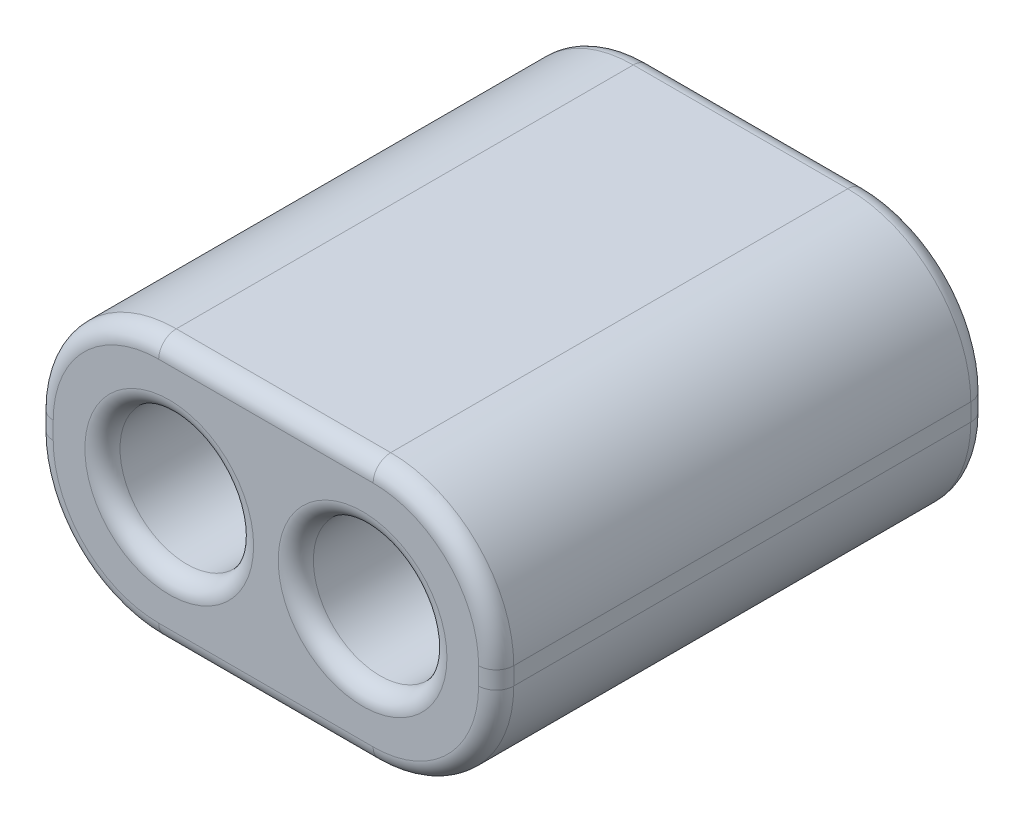
ISO-10303-21;
HEADER;
FILE_DESCRIPTION(('STEP AP214'),'2;1');
FILE_NAME('part.step','',(''),(''),'','','');
FILE_SCHEMA(('AUTOMOTIVE_DESIGN { 1 0 10303 214 1 1 1 1 }'));
ENDSEC;
DATA;
#1=APPLICATION_CONTEXT('core data for automotive mechanical design processes');
#2=APPLICATION_PROTOCOL_DEFINITION('international standard','automotive_design',2000,#1);
#3=PRODUCT_CONTEXT('',#1,'mechanical');
#4=PRODUCT('Part','Part','',(#3));
#5=PRODUCT_RELATED_PRODUCT_CATEGORY('part','',(#4));
#6=PRODUCT_DEFINITION_FORMATION('','',#4);
#7=PRODUCT_DEFINITION_CONTEXT('part definition',#1,'design');
#8=PRODUCT_DEFINITION('design','',#6,#7);
#9=PRODUCT_DEFINITION_SHAPE('','',#8);
#10=(LENGTH_UNIT() NAMED_UNIT(*) SI_UNIT(.MILLI.,.METRE.));
#11=(NAMED_UNIT(*) PLANE_ANGLE_UNIT() SI_UNIT($,.RADIAN.));
#12=(NAMED_UNIT(*) SI_UNIT($,.STERADIAN.) SOLID_ANGLE_UNIT());
#13=UNCERTAINTY_MEASURE_WITH_UNIT(LENGTH_MEASURE(1.E-05),#10,'distance_accuracy_value','');
#14=(GEOMETRIC_REPRESENTATION_CONTEXT(3) GLOBAL_UNCERTAINTY_ASSIGNED_CONTEXT((#13)) GLOBAL_UNIT_ASSIGNED_CONTEXT((#10,
#11,#12)) REPRESENTATION_CONTEXT('',''));
#15=CARTESIAN_POINT('',(0.,0.,0.));
#16=DIRECTION('',(0.,0.,1.));
#17=DIRECTION('',(1.,0.,0.));
#18=AXIS2_PLACEMENT_3D('',#15,#16,#17);
#19=CARTESIAN_POINT('',(0.,0.,14.));
#20=DIRECTION('',(0.,0.,1.));
#21=DIRECTION('',(1.,0.,0.));
#22=AXIS2_PLACEMENT_3D('',#19,#20,#21);
#23=PLANE('',#22);
#24=CARTESIAN_POINT('',(2.75,0.,14.));
#25=DIRECTION('',(0.,0.,1.));
#26=DIRECTION('',(1.,0.,0.));
#27=AXIS2_PLACEMENT_3D('',#24,#25,#26);
#28=CIRCLE('',#27,2.4);
#29=CARTESIAN_POINT('',(5.15,0.,14.));
#30=VERTEX_POINT('',#29);
#31=EDGE_CURVE('E177',#30,#30,#28,.F.);
#32=ORIENTED_EDGE('',*,*,#31,.T.);
#33=EDGE_LOOP('',(#32));
#34=FACE_BOUND('',#33,.T.);
#35=DIRECTION('',(0.,-1.,0.));
#36=VECTOR('',#35,1.);
#37=CARTESIAN_POINT('',(-6.05,-0.25,14.));
#38=LINE('',#37,#36);
#39=CARTESIAN_POINT('',(-6.05,0.249999999999999,14.));
#40=VERTEX_POINT('',#39);
#41=CARTESIAN_POINT('',(-6.05,-0.25,14.));
#42=VERTEX_POINT('',#41);
#43=EDGE_CURVE('E175',#40,#42,#38,.T.);
#44=ORIENTED_EDGE('',*,*,#43,.T.);
#45=CARTESIAN_POINT('',(-3.05,-0.249999999999999,14.));
#46=DIRECTION('',(0.,0.,1.));
#47=DIRECTION('',(1.,0.,0.));
#48=AXIS2_PLACEMENT_3D('',#45,#46,#47);
#49=CIRCLE('',#48,3.);
#50=CARTESIAN_POINT('',(-3.05,-3.25,14.));
#51=VERTEX_POINT('',#50);
#52=EDGE_CURVE('E156',#42,#51,#49,.T.);
#53=ORIENTED_EDGE('',*,*,#52,.T.);
#54=DIRECTION('',(1.,0.,0.));
#55=VECTOR('',#54,1.);
#56=CARTESIAN_POINT('',(3.05,-3.25,14.));
#57=LINE('',#56,#55);
#58=CARTESIAN_POINT('',(3.05,-3.25,14.));
#59=VERTEX_POINT('',#58);
#60=EDGE_CURVE('E164',#51,#59,#57,.T.);
#61=ORIENTED_EDGE('',*,*,#60,.T.);
#62=CARTESIAN_POINT('',(3.05,-0.249999999999999,14.));
#63=DIRECTION('',(0.,0.,1.));
#64=DIRECTION('',(1.,0.,0.));
#65=AXIS2_PLACEMENT_3D('',#62,#63,#64);
#66=CIRCLE('',#65,3.);
#67=CARTESIAN_POINT('',(6.05,-0.249999999999999,14.));
#68=VERTEX_POINT('',#67);
#69=EDGE_CURVE('E170',#59,#68,#66,.T.);
#70=ORIENTED_EDGE('',*,*,#69,.T.);
#71=DIRECTION('',(0.,1.,0.));
#72=VECTOR('',#71,1.);
#73=CARTESIAN_POINT('',(6.05,0.250000000000001,14.));
#74=LINE('',#73,#72);
#75=CARTESIAN_POINT('',(6.05,0.250000000000001,14.));
#76=VERTEX_POINT('',#75);
#77=EDGE_CURVE('E325',#68,#76,#74,.T.);
#78=ORIENTED_EDGE('',*,*,#77,.T.);
#79=CARTESIAN_POINT('',(3.05,0.25,14.));
#80=DIRECTION('',(0.,0.,1.));
#81=DIRECTION('',(1.,0.,0.));
#82=AXIS2_PLACEMENT_3D('',#79,#80,#81);
#83=CIRCLE('',#82,3.);
#84=CARTESIAN_POINT('',(3.05,3.25,14.));
#85=VERTEX_POINT('',#84);
#86=EDGE_CURVE('E327',#76,#85,#83,.T.);
#87=ORIENTED_EDGE('',*,*,#86,.T.);
#88=DIRECTION('',(-1.,0.,0.));
#89=VECTOR('',#88,1.);
#90=CARTESIAN_POINT('',(-3.05,3.25,14.));
#91=LINE('',#90,#89);
#92=CARTESIAN_POINT('',(-3.05,3.25,14.));
#93=VERTEX_POINT('',#92);
#94=EDGE_CURVE('E329',#85,#93,#91,.T.);
#95=ORIENTED_EDGE('',*,*,#94,.T.);
#96=CARTESIAN_POINT('',(-3.05,0.25,14.));
#97=DIRECTION('',(0.,0.,1.));
#98=DIRECTION('',(1.,0.,0.));
#99=AXIS2_PLACEMENT_3D('',#96,#97,#98);
#100=CIRCLE('',#99,3.);
#101=EDGE_CURVE('E181',#93,#40,#100,.T.);
#102=ORIENTED_EDGE('',*,*,#101,.T.);
#103=EDGE_LOOP('',(#44,#53,#61,#70,#78,#87,#95,#102));
#104=FACE_BOUND('',#103,.T.);
#105=CARTESIAN_POINT('',(-2.75,0.,14.));
#106=DIRECTION('',(0.,0.,1.));
#107=DIRECTION('',(1.,0.,0.));
#108=AXIS2_PLACEMENT_3D('',#105,#106,#107);
#109=CIRCLE('',#108,2.4);
#110=CARTESIAN_POINT('',(-0.35,0.,14.));
#111=VERTEX_POINT('',#110);
#112=EDGE_CURVE('E171',#111,#111,#109,.F.);
#113=ORIENTED_EDGE('',*,*,#112,.T.);
#114=EDGE_LOOP('',(#113));
#115=FACE_BOUND('',#114,.T.);
#116=ADVANCED_FACE('F35',(#34,#104,#115),#23,.T.);
#117=CARTESIAN_POINT('',(0.,0.,0.));
#118=DIRECTION('',(0.,0.,1.));
#119=DIRECTION('',(1.,0.,0.));
#120=AXIS2_PLACEMENT_3D('',#117,#118,#119);
#121=PLANE('',#120);
#122=CARTESIAN_POINT('',(2.75,0.,0.));
#123=DIRECTION('',(0.,0.,1.));
#124=DIRECTION('',(1.,0.,0.));
#125=AXIS2_PLACEMENT_3D('',#122,#123,#124);
#126=CIRCLE('',#125,2.4);
#127=CARTESIAN_POINT('',(5.15,0.,0.));
#128=VERTEX_POINT('',#127);
#129=EDGE_CURVE('E244',#128,#128,#126,.T.);
#130=ORIENTED_EDGE('',*,*,#129,.T.);
#131=EDGE_LOOP('',(#130));
#132=FACE_BOUND('',#131,.T.);
#133=CARTESIAN_POINT('',(-2.75,0.,0.));
#134=DIRECTION('',(0.,0.,1.));
#135=DIRECTION('',(1.,0.,0.));
#136=AXIS2_PLACEMENT_3D('',#133,#134,#135);
#137=CIRCLE('',#136,2.4);
#138=CARTESIAN_POINT('',(-0.35,0.,0.));
#139=VERTEX_POINT('',#138);
#140=EDGE_CURVE('E241',#139,#139,#137,.T.);
#141=ORIENTED_EDGE('',*,*,#140,.T.);
#142=EDGE_LOOP('',(#141));
#143=FACE_BOUND('',#142,.T.);
#144=DIRECTION('',(-1.,0.,0.));
#145=VECTOR('',#144,1.);
#146=CARTESIAN_POINT('',(0.,3.25,0.));
#147=LINE('',#146,#145);
#148=CARTESIAN_POINT('',(-3.05,3.25,0.));
#149=VERTEX_POINT('',#148);
#150=CARTESIAN_POINT('',(3.05,3.25,0.));
#151=VERTEX_POINT('',#150);
#152=EDGE_CURVE('E236',#149,#151,#147,.F.);
#153=ORIENTED_EDGE('',*,*,#152,.T.);
#154=CARTESIAN_POINT('',(3.05,0.25,0.));
#155=DIRECTION('',(0.,0.,1.));
#156=DIRECTION('',(1.,0.,0.));
#157=AXIS2_PLACEMENT_3D('',#154,#155,#156);
#158=CIRCLE('',#157,3.);
#159=CARTESIAN_POINT('',(6.05,0.250000000000001,0.));
#160=VERTEX_POINT('',#159);
#161=EDGE_CURVE('E238',#151,#160,#158,.F.);
#162=ORIENTED_EDGE('',*,*,#161,.T.);
#163=DIRECTION('',(0.,1.,0.));
#164=VECTOR('',#163,1.);
#165=CARTESIAN_POINT('',(6.05,0.,0.));
#166=LINE('',#165,#164);
#167=CARTESIAN_POINT('',(6.05,-0.249999999999999,0.));
#168=VERTEX_POINT('',#167);
#169=EDGE_CURVE('E205',#160,#168,#166,.F.);
#170=ORIENTED_EDGE('',*,*,#169,.T.);
#171=CARTESIAN_POINT('',(3.05,-0.249999999999999,0.));
#172=DIRECTION('',(0.,0.,1.));
#173=DIRECTION('',(1.,0.,0.));
#174=AXIS2_PLACEMENT_3D('',#171,#172,#173);
#175=CIRCLE('',#174,3.);
#176=CARTESIAN_POINT('',(3.05,-3.25,0.));
#177=VERTEX_POINT('',#176);
#178=EDGE_CURVE('E226',#168,#177,#175,.F.);
#179=ORIENTED_EDGE('',*,*,#178,.T.);
#180=DIRECTION('',(1.,0.,0.));
#181=VECTOR('',#180,1.);
#182=CARTESIAN_POINT('',(0.,-3.25,0.));
#183=LINE('',#182,#181);
#184=CARTESIAN_POINT('',(-3.05,-3.25,0.));
#185=VERTEX_POINT('',#184);
#186=EDGE_CURVE('E228',#177,#185,#183,.F.);
#187=ORIENTED_EDGE('',*,*,#186,.T.);
#188=CARTESIAN_POINT('',(-3.05,-0.249999999999999,0.));
#189=DIRECTION('',(0.,0.,1.));
#190=DIRECTION('',(1.,0.,0.));
#191=AXIS2_PLACEMENT_3D('',#188,#189,#190);
#192=CIRCLE('',#191,3.);
#193=CARTESIAN_POINT('',(-6.05,-0.25,0.));
#194=VERTEX_POINT('',#193);
#195=EDGE_CURVE('E230',#185,#194,#192,.F.);
#196=ORIENTED_EDGE('',*,*,#195,.T.);
#197=DIRECTION('',(0.,-1.,0.));
#198=VECTOR('',#197,1.);
#199=CARTESIAN_POINT('',(-6.05,0.,0.));
#200=LINE('',#199,#198);
#201=CARTESIAN_POINT('',(-6.05,0.249999999999999,0.));
#202=VERTEX_POINT('',#201);
#203=EDGE_CURVE('E232',#194,#202,#200,.F.);
#204=ORIENTED_EDGE('',*,*,#203,.T.);
#205=CARTESIAN_POINT('',(-3.05,0.25,0.));
#206=DIRECTION('',(0.,0.,1.));
#207=DIRECTION('',(1.,0.,0.));
#208=AXIS2_PLACEMENT_3D('',#205,#206,#207);
#209=CIRCLE('',#208,3.);
#210=EDGE_CURVE('E234',#202,#149,#209,.F.);
#211=ORIENTED_EDGE('',*,*,#210,.T.);
#212=EDGE_LOOP('',(#153,#162,#170,#179,#187,#196,#204,#211));
#213=FACE_BOUND('',#212,.T.);
#214=ADVANCED_FACE('F359',(#132,#143,#213),#121,.F.);
#215=CARTESIAN_POINT('',(6.55,3.75,14.));
#216=DIRECTION('',(-1.,0.,0.));
#217=DIRECTION('',(0.,-1.,0.));
#218=AXIS2_PLACEMENT_3D('',#215,#216,#217);
#219=PLANE('',#218);
#220=DIRECTION('',(0.,0.,-1.));
#221=VECTOR('',#220,1.);
#222=CARTESIAN_POINT('',(6.55,-0.249999999999999,14.));
#223=LINE('',#222,#221);
#224=CARTESIAN_POINT('',(6.55,-0.249999999999999,13.5));
#225=VERTEX_POINT('',#224);
#226=CARTESIAN_POINT('',(6.55,-0.249999999999999,0.5));
#227=VERTEX_POINT('',#226);
#228=EDGE_CURVE('E304',#225,#227,#223,.T.);
#229=ORIENTED_EDGE('',*,*,#228,.T.);
#230=DIRECTION('',(0.,1.,0.));
#231=VECTOR('',#230,1.);
#232=CARTESIAN_POINT('',(6.55,3.75,0.5));
#233=LINE('',#232,#231);
#234=CARTESIAN_POINT('',(6.55,0.250000000000001,0.5));
#235=VERTEX_POINT('',#234);
#236=EDGE_CURVE('E11',#227,#235,#233,.T.);
#237=ORIENTED_EDGE('',*,*,#236,.T.);
#238=DIRECTION('',(0.,0.,-1.));
#239=VECTOR('',#238,1.);
#240=CARTESIAN_POINT('',(6.55,0.250000000000001,14.));
#241=LINE('',#240,#239);
#242=CARTESIAN_POINT('',(6.55,0.250000000000001,13.5));
#243=VERTEX_POINT('',#242);
#244=EDGE_CURVE('E224',#235,#243,#241,.F.);
#245=ORIENTED_EDGE('',*,*,#244,.T.);
#246=DIRECTION('',(0.,1.,0.));
#247=VECTOR('',#246,1.);
#248=CARTESIAN_POINT('',(6.55,-0.249999999999999,13.5));
#249=LINE('',#248,#247);
#250=EDGE_CURVE('E196',#243,#225,#249,.F.);
#251=ORIENTED_EDGE('',*,*,#250,.T.);
#252=EDGE_LOOP('',(#229,#237,#245,#251));
#253=FACE_BOUND('',#252,.T.);
#254=ADVANCED_FACE('F373',(#253),#219,.F.);
#255=CARTESIAN_POINT('',(-6.55,3.75,14.));
#256=DIRECTION('',(0.,-1.,0.));
#257=DIRECTION('',(0.,0.,-1.));
#258=AXIS2_PLACEMENT_3D('',#255,#256,#257);
#259=PLANE('',#258);
#260=DIRECTION('',(0.,0.,-1.));
#261=VECTOR('',#260,1.);
#262=CARTESIAN_POINT('',(3.05,3.75,14.));
#263=LINE('',#262,#261);
#264=CARTESIAN_POINT('',(3.05,3.75,13.5));
#265=VERTEX_POINT('',#264);
#266=CARTESIAN_POINT('',(3.05,3.75,0.5));
#267=VERTEX_POINT('',#266);
#268=EDGE_CURVE('E314',#265,#267,#263,.T.);
#269=ORIENTED_EDGE('',*,*,#268,.T.);
#270=DIRECTION('',(-1.,0.,0.));
#271=VECTOR('',#270,1.);
#272=CARTESIAN_POINT('',(-6.55,3.75,0.5));
#273=LINE('',#272,#271);
#274=CARTESIAN_POINT('',(-3.05,3.75,0.5));
#275=VERTEX_POINT('',#274);
#276=EDGE_CURVE('E256',#267,#275,#273,.T.);
#277=ORIENTED_EDGE('',*,*,#276,.T.);
#278=DIRECTION('',(0.,0.,-1.));
#279=VECTOR('',#278,1.);
#280=CARTESIAN_POINT('',(-3.05,3.75,14.));
#281=LINE('',#280,#279);
#282=CARTESIAN_POINT('',(-3.05,3.75,13.5));
#283=VERTEX_POINT('',#282);
#284=EDGE_CURVE('E317',#275,#283,#281,.F.);
#285=ORIENTED_EDGE('',*,*,#284,.T.);
#286=DIRECTION('',(-1.,0.,0.));
#287=VECTOR('',#286,1.);
#288=CARTESIAN_POINT('',(3.05,3.75,13.5));
#289=LINE('',#288,#287);
#290=EDGE_CURVE('E191',#283,#265,#289,.F.);
#291=ORIENTED_EDGE('',*,*,#290,.T.);
#292=EDGE_LOOP('',(#269,#277,#285,#291));
#293=FACE_BOUND('',#292,.T.);
#294=ADVANCED_FACE('F405',(#293),#259,.F.);
#295=CARTESIAN_POINT('',(-6.55,3.75,14.));
#296=DIRECTION('',(1.,0.,0.));
#297=DIRECTION('',(0.,1.,0.));
#298=AXIS2_PLACEMENT_3D('',#295,#296,#297);
#299=PLANE('',#298);
#300=DIRECTION('',(0.,0.,-1.));
#301=VECTOR('',#300,1.);
#302=CARTESIAN_POINT('',(-6.55,0.249999999999999,14.));
#303=LINE('',#302,#301);
#304=CARTESIAN_POINT('',(-6.55,0.249999999999999,13.5));
#305=VERTEX_POINT('',#304);
#306=CARTESIAN_POINT('',(-6.55,0.249999999999999,0.5));
#307=VERTEX_POINT('',#306);
#308=EDGE_CURVE('E306',#305,#307,#303,.T.);
#309=ORIENTED_EDGE('',*,*,#308,.T.);
#310=DIRECTION('',(0.,-1.,0.));
#311=VECTOR('',#310,1.);
#312=CARTESIAN_POINT('',(-6.55,3.75,0.5));
#313=LINE('',#312,#311);
#314=CARTESIAN_POINT('',(-6.55,-0.25,0.5));
#315=VERTEX_POINT('',#314);
#316=EDGE_CURVE('E260',#307,#315,#313,.T.);
#317=ORIENTED_EDGE('',*,*,#316,.T.);
#318=DIRECTION('',(0.,0.,-1.));
#319=VECTOR('',#318,1.);
#320=CARTESIAN_POINT('',(-6.55,-0.25,14.));
#321=LINE('',#320,#319);
#322=CARTESIAN_POINT('',(-6.55,-0.25,13.5));
#323=VERTEX_POINT('',#322);
#324=EDGE_CURVE('E301',#315,#323,#321,.F.);
#325=ORIENTED_EDGE('',*,*,#324,.T.);
#326=DIRECTION('',(0.,-1.,0.));
#327=VECTOR('',#326,1.);
#328=CARTESIAN_POINT('',(-6.55,0.249999999999999,13.5));
#329=LINE('',#328,#327);
#330=EDGE_CURVE('E186',#323,#305,#329,.F.);
#331=ORIENTED_EDGE('',*,*,#330,.T.);
#332=EDGE_LOOP('',(#309,#317,#325,#331));
#333=FACE_BOUND('',#332,.T.);
#334=ADVANCED_FACE('F342',(#333),#299,.F.);
#335=CARTESIAN_POINT('',(-6.55,-3.75,14.));
#336=DIRECTION('',(0.,1.,0.));
#337=DIRECTION('',(0.,0.,1.));
#338=AXIS2_PLACEMENT_3D('',#335,#336,#337);
#339=PLANE('',#338);
#340=DIRECTION('',(0.,0.,-1.));
#341=VECTOR('',#340,1.);
#342=CARTESIAN_POINT('',(-3.05,-3.75,14.));
#343=LINE('',#342,#341);
#344=CARTESIAN_POINT('',(-3.05,-3.75,13.5));
#345=VERTEX_POINT('',#344);
#346=CARTESIAN_POINT('',(-3.05,-3.75,0.5));
#347=VERTEX_POINT('',#346);
#348=EDGE_CURVE('E300',#345,#347,#343,.T.);
#349=ORIENTED_EDGE('',*,*,#348,.T.);
#350=DIRECTION('',(1.,0.,0.));
#351=VECTOR('',#350,1.);
#352=CARTESIAN_POINT('',(-6.55,-3.75,0.5));
#353=LINE('',#352,#351);
#354=CARTESIAN_POINT('',(3.05,-3.75,0.5));
#355=VERTEX_POINT('',#354);
#356=EDGE_CURVE('E59',#347,#355,#353,.T.);
#357=ORIENTED_EDGE('',*,*,#356,.T.);
#358=DIRECTION('',(0.,0.,-1.));
#359=VECTOR('',#358,1.);
#360=CARTESIAN_POINT('',(3.05,-3.75,14.));
#361=LINE('',#360,#359);
#362=CARTESIAN_POINT('',(3.05,-3.75,13.5));
#363=VERTEX_POINT('',#362);
#364=EDGE_CURVE('E303',#355,#363,#361,.F.);
#365=ORIENTED_EDGE('',*,*,#364,.T.);
#366=DIRECTION('',(1.,0.,0.));
#367=VECTOR('',#366,1.);
#368=CARTESIAN_POINT('',(-3.05,-3.75,13.5));
#369=LINE('',#368,#367);
#370=EDGE_CURVE('E201',#363,#345,#369,.F.);
#371=ORIENTED_EDGE('',*,*,#370,.T.);
#372=EDGE_LOOP('',(#349,#357,#365,#371));
#373=FACE_BOUND('',#372,.T.);
#374=ADVANCED_FACE('F302',(#373),#339,.F.);
#375=CARTESIAN_POINT('',(-2.75,0.,14.));
#376=DIRECTION('',(0.,0.,-1.));
#377=DIRECTION('',(-1.,0.,0.));
#378=AXIS2_PLACEMENT_3D('',#375,#376,#377);
#379=CYLINDRICAL_SURFACE('',#378,1.9);
#380=CARTESIAN_POINT('',(-2.75,0.,0.5));
#381=DIRECTION('',(0.,0.,1.));
#382=DIRECTION('',(1.,0.,0.));
#383=AXIS2_PLACEMENT_3D('',#380,#381,#382);
#384=CIRCLE('',#383,1.9);
#385=CARTESIAN_POINT('',(-0.85,0.,0.5));
#386=VERTEX_POINT('',#385);
#387=EDGE_CURVE('E250',#386,#386,#384,.F.);
#388=ORIENTED_EDGE('',*,*,#387,.T.);
#389=EDGE_LOOP('',(#388));
#390=FACE_BOUND('',#389,.T.);
#391=CARTESIAN_POINT('',(-2.75,0.,13.5));
#392=DIRECTION('',(0.,0.,1.));
#393=DIRECTION('',(1.,0.,0.));
#394=AXIS2_PLACEMENT_3D('',#391,#392,#393);
#395=CIRCLE('',#394,1.9);
#396=CARTESIAN_POINT('',(-0.85,0.,13.5));
#397=VERTEX_POINT('',#396);
#398=EDGE_CURVE('E203',#397,#397,#395,.T.);
#399=ORIENTED_EDGE('',*,*,#398,.T.);
#400=EDGE_LOOP('',(#399));
#401=FACE_BOUND('',#400,.T.);
#402=ADVANCED_FACE('F398',(#390,#401),#379,.F.);
#403=CARTESIAN_POINT('',(2.75,0.,14.));
#404=DIRECTION('',(0.,0.,-1.));
#405=DIRECTION('',(-1.,0.,0.));
#406=AXIS2_PLACEMENT_3D('',#403,#404,#405);
#407=CYLINDRICAL_SURFACE('',#406,1.9);
#408=CARTESIAN_POINT('',(2.75,0.,0.5));
#409=DIRECTION('',(0.,0.,1.));
#410=DIRECTION('',(1.,0.,0.));
#411=AXIS2_PLACEMENT_3D('',#408,#409,#410);
#412=CIRCLE('',#411,1.9);
#413=CARTESIAN_POINT('',(4.65,0.,0.5));
#414=VERTEX_POINT('',#413);
#415=EDGE_CURVE('E247',#414,#414,#412,.F.);
#416=ORIENTED_EDGE('',*,*,#415,.T.);
#417=EDGE_LOOP('',(#416));
#418=FACE_BOUND('',#417,.T.);
#419=CARTESIAN_POINT('',(2.75,0.,13.5));
#420=DIRECTION('',(0.,0.,1.));
#421=DIRECTION('',(1.,0.,0.));
#422=AXIS2_PLACEMENT_3D('',#419,#420,#421);
#423=CIRCLE('',#422,1.9);
#424=CARTESIAN_POINT('',(4.65,0.,13.5));
#425=VERTEX_POINT('',#424);
#426=EDGE_CURVE('E319',#425,#425,#423,.T.);
#427=ORIENTED_EDGE('',*,*,#426,.T.);
#428=EDGE_LOOP('',(#427));
#429=FACE_BOUND('',#428,.T.);
#430=ADVANCED_FACE('F414',(#418,#429),#407,.F.);
#431=CARTESIAN_POINT('',(3.05,-0.249999999999999,14.));
#432=DIRECTION('',(0.,0.,-1.));
#433=DIRECTION('',(-1.,0.,0.));
#434=AXIS2_PLACEMENT_3D('',#431,#432,#433);
#435=CYLINDRICAL_SURFACE('',#434,3.5);
#436=ORIENTED_EDGE('',*,*,#364,.F.);
#437=CARTESIAN_POINT('',(3.05,-0.249999999999999,0.5));
#438=DIRECTION('',(0.,0.,1.));
#439=DIRECTION('',(1.,0.,0.));
#440=AXIS2_PLACEMENT_3D('',#437,#438,#439);
#441=CIRCLE('',#440,3.5);
#442=EDGE_CURVE('E44',#355,#227,#441,.T.);
#443=ORIENTED_EDGE('',*,*,#442,.T.);
#444=ORIENTED_EDGE('',*,*,#228,.F.);
#445=CARTESIAN_POINT('',(3.05,-0.249999999999999,13.5));
#446=DIRECTION('',(0.,0.,1.));
#447=DIRECTION('',(1.,0.,0.));
#448=AXIS2_PLACEMENT_3D('',#445,#446,#447);
#449=CIRCLE('',#448,3.5);
#450=EDGE_CURVE('E198',#225,#363,#449,.F.);
#451=ORIENTED_EDGE('',*,*,#450,.T.);
#452=EDGE_LOOP('',(#436,#443,#444,#451));
#453=FACE_BOUND('',#452,.T.);
#454=ADVANCED_FACE('F411',(#453),#435,.T.);
#455=CARTESIAN_POINT('',(-3.05,-0.249999999999999,14.));
#456=DIRECTION('',(0.,0.,-1.));
#457=DIRECTION('',(-1.,0.,0.));
#458=AXIS2_PLACEMENT_3D('',#455,#456,#457);
#459=CYLINDRICAL_SURFACE('',#458,3.5);
#460=ORIENTED_EDGE('',*,*,#324,.F.);
#461=CARTESIAN_POINT('',(-3.05,-0.249999999999999,0.5));
#462=DIRECTION('',(0.,0.,1.));
#463=DIRECTION('',(1.,0.,0.));
#464=AXIS2_PLACEMENT_3D('',#461,#462,#463);
#465=CIRCLE('',#464,3.5);
#466=EDGE_CURVE('E262',#315,#347,#465,.T.);
#467=ORIENTED_EDGE('',*,*,#466,.T.);
#468=ORIENTED_EDGE('',*,*,#348,.F.);
#469=CARTESIAN_POINT('',(-3.05,-0.249999999999999,13.5));
#470=DIRECTION('',(0.,0.,1.));
#471=DIRECTION('',(1.,0.,0.));
#472=AXIS2_PLACEMENT_3D('',#469,#470,#471);
#473=CIRCLE('',#472,3.5);
#474=EDGE_CURVE('E158',#345,#323,#473,.F.);
#475=ORIENTED_EDGE('',*,*,#474,.T.);
#476=EDGE_LOOP('',(#460,#467,#468,#475));
#477=FACE_BOUND('',#476,.T.);
#478=ADVANCED_FACE('F299',(#477),#459,.T.);
#479=CARTESIAN_POINT('',(-3.05,0.25,14.));
#480=DIRECTION('',(0.,0.,-1.));
#481=DIRECTION('',(-1.,0.,0.));
#482=AXIS2_PLACEMENT_3D('',#479,#480,#481);
#483=CYLINDRICAL_SURFACE('',#482,3.5);
#484=ORIENTED_EDGE('',*,*,#284,.F.);
#485=CARTESIAN_POINT('',(-3.05,0.25,0.5));
#486=DIRECTION('',(0.,0.,1.));
#487=DIRECTION('',(1.,0.,0.));
#488=AXIS2_PLACEMENT_3D('',#485,#486,#487);
#489=CIRCLE('',#488,3.5);
#490=EDGE_CURVE('E258',#275,#307,#489,.T.);
#491=ORIENTED_EDGE('',*,*,#490,.T.);
#492=ORIENTED_EDGE('',*,*,#308,.F.);
#493=CARTESIAN_POINT('',(-3.05,0.25,13.5));
#494=DIRECTION('',(0.,0.,1.));
#495=DIRECTION('',(1.,0.,0.));
#496=AXIS2_PLACEMENT_3D('',#493,#494,#495);
#497=CIRCLE('',#496,3.5);
#498=EDGE_CURVE('E188',#305,#283,#497,.F.);
#499=ORIENTED_EDGE('',*,*,#498,.T.);
#500=EDGE_LOOP('',(#484,#491,#492,#499));
#501=FACE_BOUND('',#500,.T.);
#502=ADVANCED_FACE('F345',(#501),#483,.T.);
#503=CARTESIAN_POINT('',(3.05,0.25,14.));
#504=DIRECTION('',(0.,0.,-1.));
#505=DIRECTION('',(-1.,0.,0.));
#506=AXIS2_PLACEMENT_3D('',#503,#504,#505);
#507=CYLINDRICAL_SURFACE('',#506,3.5);
#508=ORIENTED_EDGE('',*,*,#244,.F.);
#509=CARTESIAN_POINT('',(3.05,0.25,0.5));
#510=DIRECTION('',(0.,0.,1.));
#511=DIRECTION('',(1.,0.,0.));
#512=AXIS2_PLACEMENT_3D('',#509,#510,#511);
#513=CIRCLE('',#512,3.5);
#514=EDGE_CURVE('E253',#235,#267,#513,.T.);
#515=ORIENTED_EDGE('',*,*,#514,.T.);
#516=ORIENTED_EDGE('',*,*,#268,.F.);
#517=CARTESIAN_POINT('',(3.05,0.25,13.5));
#518=DIRECTION('',(0.,0.,1.));
#519=DIRECTION('',(1.,0.,0.));
#520=AXIS2_PLACEMENT_3D('',#517,#518,#519);
#521=CIRCLE('',#520,3.5);
#522=EDGE_CURVE('E193',#265,#243,#521,.F.);
#523=ORIENTED_EDGE('',*,*,#522,.T.);
#524=EDGE_LOOP('',(#508,#515,#516,#523));
#525=FACE_BOUND('',#524,.T.);
#526=ADVANCED_FACE('F376',(#525),#507,.T.);
#527=CARTESIAN_POINT('',(2.75,0.,13.5));
#528=DIRECTION('',(0.,0.,1.));
#529=DIRECTION('',(1.,0.,0.));
#530=AXIS2_PLACEMENT_3D('',#527,#528,#529);
#531=TOROIDAL_SURFACE('',#530,2.4,0.5);
#532=ORIENTED_EDGE('',*,*,#31,.F.);
#533=EDGE_LOOP('',(#532));
#534=FACE_BOUND('',#533,.T.);
#535=ORIENTED_EDGE('',*,*,#426,.F.);
#536=EDGE_LOOP('',(#535));
#537=FACE_BOUND('',#536,.T.);
#538=ADVANCED_FACE('F421',(#534,#537),#531,.T.);
#539=CARTESIAN_POINT('',(3.05,0.25,13.5));
#540=DIRECTION('',(0.,0.,1.));
#541=DIRECTION('',(1.,0.,0.));
#542=AXIS2_PLACEMENT_3D('',#539,#540,#541);
#543=TOROIDAL_SURFACE('',#542,3.,0.5);
#544=CARTESIAN_POINT('',(6.05,0.250000000000001,13.5));
#545=DIRECTION('',(0.,-1.,0.));
#546=DIRECTION('',(1.,0.,0.));
#547=AXIS2_PLACEMENT_3D('',#544,#545,#546);
#548=CIRCLE('',#547,0.5);
#549=EDGE_CURVE('E218',#243,#76,#548,.T.);
#550=ORIENTED_EDGE('',*,*,#549,.F.);
#551=ORIENTED_EDGE('',*,*,#522,.F.);
#552=CARTESIAN_POINT('',(3.05,3.25,13.5));
#553=DIRECTION('',(-1.,0.,0.));
#554=DIRECTION('',(0.,0.,1.));
#555=AXIS2_PLACEMENT_3D('',#552,#553,#554);
#556=CIRCLE('',#555,0.5);
#557=EDGE_CURVE('E221',#85,#265,#556,.T.);
#558=ORIENTED_EDGE('',*,*,#557,.F.);
#559=ORIENTED_EDGE('',*,*,#86,.F.);
#560=EDGE_LOOP('',(#550,#551,#558,#559));
#561=FACE_BOUND('',#560,.T.);
#562=ADVANCED_FACE('F424',(#561),#543,.T.);
#563=CARTESIAN_POINT('',(0.,3.25,13.5));
#564=DIRECTION('',(1.,0.,0.));
#565=DIRECTION('',(0.,0.,-1.));
#566=AXIS2_PLACEMENT_3D('',#563,#564,#565);
#567=CYLINDRICAL_SURFACE('',#566,0.5);
#568=ORIENTED_EDGE('',*,*,#557,.T.);
#569=ORIENTED_EDGE('',*,*,#290,.F.);
#570=CARTESIAN_POINT('',(-3.05,3.25,13.5));
#571=DIRECTION('',(-1.,0.,0.));
#572=DIRECTION('',(0.,0.,1.));
#573=AXIS2_PLACEMENT_3D('',#570,#571,#572);
#574=CIRCLE('',#573,0.5);
#575=EDGE_CURVE('E215',#93,#283,#574,.T.);
#576=ORIENTED_EDGE('',*,*,#575,.F.);
#577=ORIENTED_EDGE('',*,*,#94,.F.);
#578=EDGE_LOOP('',(#568,#569,#576,#577));
#579=FACE_BOUND('',#578,.T.);
#580=ADVANCED_FACE('F442',(#579),#567,.T.);
#581=CARTESIAN_POINT('',(6.05,0.,13.5));
#582=DIRECTION('',(0.,-1.,0.));
#583=DIRECTION('',(1.,0.,0.));
#584=AXIS2_PLACEMENT_3D('',#581,#582,#583);
#585=CYLINDRICAL_SURFACE('',#584,0.5);
#586=ORIENTED_EDGE('',*,*,#549,.T.);
#587=ORIENTED_EDGE('',*,*,#77,.F.);
#588=CARTESIAN_POINT('',(6.05,-0.249999999999999,13.5));
#589=DIRECTION('',(0.,-1.,0.));
#590=DIRECTION('',(1.,0.,0.));
#591=AXIS2_PLACEMENT_3D('',#588,#589,#590);
#592=CIRCLE('',#591,0.5);
#593=EDGE_CURVE('E212',#225,#68,#592,.T.);
#594=ORIENTED_EDGE('',*,*,#593,.F.);
#595=ORIENTED_EDGE('',*,*,#250,.F.);
#596=EDGE_LOOP('',(#586,#587,#594,#595));
#597=FACE_BOUND('',#596,.T.);
#598=ADVANCED_FACE('F439',(#597),#585,.T.);
#599=CARTESIAN_POINT('',(-3.05,0.25,13.5));
#600=DIRECTION('',(0.,0.,1.));
#601=DIRECTION('',(1.,0.,0.));
#602=AXIS2_PLACEMENT_3D('',#599,#600,#601);
#603=TOROIDAL_SURFACE('',#602,3.,0.5);
#604=ORIENTED_EDGE('',*,*,#575,.T.);
#605=ORIENTED_EDGE('',*,*,#498,.F.);
#606=CARTESIAN_POINT('',(-6.05,0.249999999999999,13.5));
#607=DIRECTION('',(0.,-1.,0.));
#608=DIRECTION('',(1.,0.,0.));
#609=AXIS2_PLACEMENT_3D('',#606,#607,#608);
#610=CIRCLE('',#609,0.5);
#611=EDGE_CURVE('E209',#40,#305,#610,.T.);
#612=ORIENTED_EDGE('',*,*,#611,.F.);
#613=ORIENTED_EDGE('',*,*,#101,.F.);
#614=EDGE_LOOP('',(#604,#605,#612,#613));
#615=FACE_BOUND('',#614,.T.);
#616=ADVANCED_FACE('F336',(#615),#603,.T.);
#617=CARTESIAN_POINT('',(3.05,-0.249999999999999,13.5));
#618=DIRECTION('',(0.,0.,1.));
#619=DIRECTION('',(1.,0.,0.));
#620=AXIS2_PLACEMENT_3D('',#617,#618,#619);
#621=TOROIDAL_SURFACE('',#620,3.,0.5);
#622=ORIENTED_EDGE('',*,*,#593,.T.);
#623=ORIENTED_EDGE('',*,*,#69,.F.);
#624=CARTESIAN_POINT('',(3.05,-3.25,13.5));
#625=DIRECTION('',(-1.,0.,0.));
#626=DIRECTION('',(0.,0.,1.));
#627=AXIS2_PLACEMENT_3D('',#624,#625,#626);
#628=CIRCLE('',#627,0.5);
#629=EDGE_CURVE('E167',#363,#59,#628,.T.);
#630=ORIENTED_EDGE('',*,*,#629,.F.);
#631=ORIENTED_EDGE('',*,*,#450,.F.);
#632=EDGE_LOOP('',(#622,#623,#630,#631));
#633=FACE_BOUND('',#632,.T.);
#634=ADVANCED_FACE('F433',(#633),#621,.T.);
#635=CARTESIAN_POINT('',(-6.05,0.,13.5));
#636=DIRECTION('',(0.,1.,0.));
#637=DIRECTION('',(-1.,0.,0.));
#638=AXIS2_PLACEMENT_3D('',#635,#636,#637);
#639=CYLINDRICAL_SURFACE('',#638,0.5);
#640=ORIENTED_EDGE('',*,*,#611,.T.);
#641=ORIENTED_EDGE('',*,*,#330,.F.);
#642=CARTESIAN_POINT('',(-6.05,-0.25,13.5));
#643=DIRECTION('',(0.,-1.,0.));
#644=DIRECTION('',(1.,0.,0.));
#645=AXIS2_PLACEMENT_3D('',#642,#643,#644);
#646=CIRCLE('',#645,0.5);
#647=EDGE_CURVE('E161',#42,#323,#646,.T.);
#648=ORIENTED_EDGE('',*,*,#647,.F.);
#649=ORIENTED_EDGE('',*,*,#43,.F.);
#650=EDGE_LOOP('',(#640,#641,#648,#649));
#651=FACE_BOUND('',#650,.T.);
#652=ADVANCED_FACE('F339',(#651),#639,.T.);
#653=CARTESIAN_POINT('',(0.,-3.25,13.5));
#654=DIRECTION('',(-1.,0.,0.));
#655=DIRECTION('',(0.,0.,1.));
#656=AXIS2_PLACEMENT_3D('',#653,#654,#655);
#657=CYLINDRICAL_SURFACE('',#656,0.5);
#658=ORIENTED_EDGE('',*,*,#629,.T.);
#659=ORIENTED_EDGE('',*,*,#60,.F.);
#660=CARTESIAN_POINT('',(-3.05,-3.25,13.5));
#661=DIRECTION('',(-1.,0.,0.));
#662=DIRECTION('',(0.,0.,1.));
#663=AXIS2_PLACEMENT_3D('',#660,#661,#662);
#664=CIRCLE('',#663,0.5);
#665=EDGE_CURVE('E151',#345,#51,#664,.T.);
#666=ORIENTED_EDGE('',*,*,#665,.F.);
#667=ORIENTED_EDGE('',*,*,#370,.F.);
#668=EDGE_LOOP('',(#658,#659,#666,#667));
#669=FACE_BOUND('',#668,.T.);
#670=ADVANCED_FACE('F165',(#669),#657,.T.);
#671=CARTESIAN_POINT('',(-3.05,-0.249999999999999,13.5));
#672=DIRECTION('',(0.,0.,1.));
#673=DIRECTION('',(1.,0.,0.));
#674=AXIS2_PLACEMENT_3D('',#671,#672,#673);
#675=TOROIDAL_SURFACE('',#674,3.,0.5);
#676=ORIENTED_EDGE('',*,*,#647,.T.);
#677=ORIENTED_EDGE('',*,*,#474,.F.);
#678=ORIENTED_EDGE('',*,*,#665,.T.);
#679=ORIENTED_EDGE('',*,*,#52,.F.);
#680=EDGE_LOOP('',(#676,#677,#678,#679));
#681=FACE_BOUND('',#680,.T.);
#682=ADVANCED_FACE('F154',(#681),#675,.T.);
#683=CARTESIAN_POINT('',(-2.75,0.,13.5));
#684=DIRECTION('',(0.,0.,1.));
#685=DIRECTION('',(1.,0.,0.));
#686=AXIS2_PLACEMENT_3D('',#683,#684,#685);
#687=TOROIDAL_SURFACE('',#686,2.4,0.5);
#688=ORIENTED_EDGE('',*,*,#112,.F.);
#689=EDGE_LOOP('',(#688));
#690=FACE_BOUND('',#689,.T.);
#691=ORIENTED_EDGE('',*,*,#398,.F.);
#692=EDGE_LOOP('',(#691));
#693=FACE_BOUND('',#692,.T.);
#694=ADVANCED_FACE('F428',(#690,#693),#687,.T.);
#695=CARTESIAN_POINT('',(2.75,0.,0.5));
#696=DIRECTION('',(0.,0.,1.));
#697=DIRECTION('',(1.,0.,0.));
#698=AXIS2_PLACEMENT_3D('',#695,#696,#697);
#699=TOROIDAL_SURFACE('',#698,2.4,0.5);
#700=ORIENTED_EDGE('',*,*,#415,.F.);
#701=EDGE_LOOP('',(#700));
#702=FACE_BOUND('',#701,.T.);
#703=ORIENTED_EDGE('',*,*,#129,.F.);
#704=EDGE_LOOP('',(#703));
#705=FACE_BOUND('',#704,.T.);
#706=ADVANCED_FACE('F452',(#702,#705),#699,.T.);
#707=CARTESIAN_POINT('',(-2.75,0.,0.5));
#708=DIRECTION('',(0.,0.,1.));
#709=DIRECTION('',(1.,0.,0.));
#710=AXIS2_PLACEMENT_3D('',#707,#708,#709);
#711=TOROIDAL_SURFACE('',#710,2.4,0.5);
#712=ORIENTED_EDGE('',*,*,#387,.F.);
#713=EDGE_LOOP('',(#712));
#714=FACE_BOUND('',#713,.T.);
#715=ORIENTED_EDGE('',*,*,#140,.F.);
#716=EDGE_LOOP('',(#715));
#717=FACE_BOUND('',#716,.T.);
#718=ADVANCED_FACE('F455',(#714,#717),#711,.T.);
#719=CARTESIAN_POINT('',(-3.05,-0.249999999999999,0.5));
#720=DIRECTION('',(0.,0.,1.));
#721=DIRECTION('',(1.,0.,0.));
#722=AXIS2_PLACEMENT_3D('',#719,#720,#721);
#723=TOROIDAL_SURFACE('',#722,3.,0.5);
#724=CARTESIAN_POINT('',(-3.05,-3.25,0.5));
#725=DIRECTION('',(1.,0.,0.));
#726=DIRECTION('',(0.,0.,-1.));
#727=AXIS2_PLACEMENT_3D('',#724,#725,#726);
#728=CIRCLE('',#727,0.5);
#729=EDGE_CURVE('E281',#347,#185,#728,.T.);
#730=ORIENTED_EDGE('',*,*,#729,.F.);
#731=ORIENTED_EDGE('',*,*,#466,.F.);
#732=CARTESIAN_POINT('',(-6.05,-0.25,0.5));
#733=DIRECTION('',(0.,1.,0.));
#734=DIRECTION('',(-1.,0.,0.));
#735=AXIS2_PLACEMENT_3D('',#732,#733,#734);
#736=CIRCLE('',#735,0.5);
#737=EDGE_CURVE('E39',#194,#315,#736,.T.);
#738=ORIENTED_EDGE('',*,*,#737,.F.);
#739=ORIENTED_EDGE('',*,*,#195,.F.);
#740=EDGE_LOOP('',(#730,#731,#738,#739));
#741=FACE_BOUND('',#740,.T.);
#742=ADVANCED_FACE('F37',(#741),#723,.T.);
#743=CARTESIAN_POINT('',(-6.05,3.75,0.5));
#744=DIRECTION('',(0.,-1.,0.));
#745=DIRECTION('',(1.,0.,0.));
#746=AXIS2_PLACEMENT_3D('',#743,#744,#745);
#747=CYLINDRICAL_SURFACE('',#746,0.5);
#748=ORIENTED_EDGE('',*,*,#737,.T.);
#749=ORIENTED_EDGE('',*,*,#316,.F.);
#750=CARTESIAN_POINT('',(-6.05,0.249999999999999,0.5));
#751=DIRECTION('',(0.,1.,0.));
#752=DIRECTION('',(-1.,0.,0.));
#753=AXIS2_PLACEMENT_3D('',#750,#751,#752);
#754=CIRCLE('',#753,0.5);
#755=EDGE_CURVE('E279',#202,#307,#754,.T.);
#756=ORIENTED_EDGE('',*,*,#755,.F.);
#757=ORIENTED_EDGE('',*,*,#203,.F.);
#758=EDGE_LOOP('',(#748,#749,#756,#757));
#759=FACE_BOUND('',#758,.T.);
#760=ADVANCED_FACE('F291',(#759),#747,.T.);
#761=CARTESIAN_POINT('',(-6.55,-3.25,0.5));
#762=DIRECTION('',(1.,0.,0.));
#763=DIRECTION('',(0.,0.,-1.));
#764=AXIS2_PLACEMENT_3D('',#761,#762,#763);
#765=CYLINDRICAL_SURFACE('',#764,0.5);
#766=ORIENTED_EDGE('',*,*,#729,.T.);
#767=ORIENTED_EDGE('',*,*,#186,.F.);
#768=CARTESIAN_POINT('',(3.05,-3.25,0.5));
#769=DIRECTION('',(1.,0.,0.));
#770=DIRECTION('',(0.,0.,-1.));
#771=AXIS2_PLACEMENT_3D('',#768,#769,#770);
#772=CIRCLE('',#771,0.5);
#773=EDGE_CURVE('E276',#355,#177,#772,.T.);
#774=ORIENTED_EDGE('',*,*,#773,.F.);
#775=ORIENTED_EDGE('',*,*,#356,.F.);
#776=EDGE_LOOP('',(#766,#767,#774,#775));
#777=FACE_BOUND('',#776,.T.);
#778=ADVANCED_FACE('F362',(#777),#765,.T.);
#779=CARTESIAN_POINT('',(-3.05,0.25,0.5));
#780=DIRECTION('',(0.,0.,1.));
#781=DIRECTION('',(1.,0.,0.));
#782=AXIS2_PLACEMENT_3D('',#779,#780,#781);
#783=TOROIDAL_SURFACE('',#782,3.,0.5);
#784=ORIENTED_EDGE('',*,*,#755,.T.);
#785=ORIENTED_EDGE('',*,*,#490,.F.);
#786=CARTESIAN_POINT('',(-3.05,3.25,0.5));
#787=DIRECTION('',(1.,0.,0.));
#788=DIRECTION('',(0.,0.,-1.));
#789=AXIS2_PLACEMENT_3D('',#786,#787,#788);
#790=CIRCLE('',#789,0.5);
#791=EDGE_CURVE('E273',#149,#275,#790,.T.);
#792=ORIENTED_EDGE('',*,*,#791,.F.);
#793=ORIENTED_EDGE('',*,*,#210,.F.);
#794=EDGE_LOOP('',(#784,#785,#792,#793));
#795=FACE_BOUND('',#794,.T.);
#796=ADVANCED_FACE('F350',(#795),#783,.T.);
#797=CARTESIAN_POINT('',(3.05,-0.249999999999999,0.5));
#798=DIRECTION('',(0.,0.,1.));
#799=DIRECTION('',(1.,0.,0.));
#800=AXIS2_PLACEMENT_3D('',#797,#798,#799);
#801=TOROIDAL_SURFACE('',#800,3.,0.5);
#802=ORIENTED_EDGE('',*,*,#773,.T.);
#803=ORIENTED_EDGE('',*,*,#178,.F.);
#804=CARTESIAN_POINT('',(6.05,-0.249999999999999,0.5));
#805=DIRECTION('',(0.,1.,0.));
#806=DIRECTION('',(-1.,0.,0.));
#807=AXIS2_PLACEMENT_3D('',#804,#805,#806);
#808=CIRCLE('',#807,0.5);
#809=EDGE_CURVE('E270',#227,#168,#808,.T.);
#810=ORIENTED_EDGE('',*,*,#809,.F.);
#811=ORIENTED_EDGE('',*,*,#442,.F.);
#812=EDGE_LOOP('',(#802,#803,#810,#811));
#813=FACE_BOUND('',#812,.T.);
#814=ADVANCED_FACE('F364',(#813),#801,.T.);
#815=CARTESIAN_POINT('',(-6.55,3.25,0.5));
#816=DIRECTION('',(-1.,0.,0.));
#817=DIRECTION('',(0.,0.,1.));
#818=AXIS2_PLACEMENT_3D('',#815,#816,#817);
#819=CYLINDRICAL_SURFACE('',#818,0.5);
#820=ORIENTED_EDGE('',*,*,#791,.T.);
#821=ORIENTED_EDGE('',*,*,#276,.F.);
#822=CARTESIAN_POINT('',(3.05,3.25,0.5));
#823=DIRECTION('',(1.,0.,0.));
#824=DIRECTION('',(0.,0.,-1.));
#825=AXIS2_PLACEMENT_3D('',#822,#823,#824);
#826=CIRCLE('',#825,0.5);
#827=EDGE_CURVE('E268',#151,#267,#826,.T.);
#828=ORIENTED_EDGE('',*,*,#827,.F.);
#829=ORIENTED_EDGE('',*,*,#152,.F.);
#830=EDGE_LOOP('',(#820,#821,#828,#829));
#831=FACE_BOUND('',#830,.T.);
#832=ADVANCED_FACE('F355',(#831),#819,.T.);
#833=CARTESIAN_POINT('',(6.05,3.75,0.5));
#834=DIRECTION('',(0.,1.,0.));
#835=DIRECTION('',(-1.,0.,0.));
#836=AXIS2_PLACEMENT_3D('',#833,#834,#835);
#837=CYLINDRICAL_SURFACE('',#836,0.5);
#838=ORIENTED_EDGE('',*,*,#809,.T.);
#839=ORIENTED_EDGE('',*,*,#169,.F.);
#840=CARTESIAN_POINT('',(6.05,0.250000000000001,0.5));
#841=DIRECTION('',(0.,1.,0.));
#842=DIRECTION('',(-1.,0.,0.));
#843=AXIS2_PLACEMENT_3D('',#840,#841,#842);
#844=CIRCLE('',#843,0.5);
#845=EDGE_CURVE('E266',#235,#160,#844,.T.);
#846=ORIENTED_EDGE('',*,*,#845,.F.);
#847=ORIENTED_EDGE('',*,*,#236,.F.);
#848=EDGE_LOOP('',(#838,#839,#846,#847));
#849=FACE_BOUND('',#848,.T.);
#850=ADVANCED_FACE('F370',(#849),#837,.T.);
#851=CARTESIAN_POINT('',(3.05,0.25,0.5));
#852=DIRECTION('',(0.,0.,1.));
#853=DIRECTION('',(1.,0.,0.));
#854=AXIS2_PLACEMENT_3D('',#851,#852,#853);
#855=TOROIDAL_SURFACE('',#854,3.,0.5);
#856=ORIENTED_EDGE('',*,*,#827,.T.);
#857=ORIENTED_EDGE('',*,*,#514,.F.);
#858=ORIENTED_EDGE('',*,*,#845,.T.);
#859=ORIENTED_EDGE('',*,*,#161,.F.);
#860=EDGE_LOOP('',(#856,#857,#858,#859));
#861=FACE_BOUND('',#860,.T.);
#862=ADVANCED_FACE('F381',(#861),#855,.T.);
#863=CLOSED_SHELL('',(#116,#214,#254,#294,#334,#374,#402,#430,#454,#478,#502,#526,#538,#562,
#580,#598,#616,#634,#652,#670,#682,#694,#706,#718,#742,#760,#778,#796,#814,#832,#850,#862));
#864=MANIFOLD_SOLID_BREP('B2',#863);
#865=ADVANCED_BREP_SHAPE_REPRESENTATION('',(#18,#864),#14);
#866=SHAPE_DEFINITION_REPRESENTATION(#9,#865);
ENDSEC;
END-ISO-10303-21;
